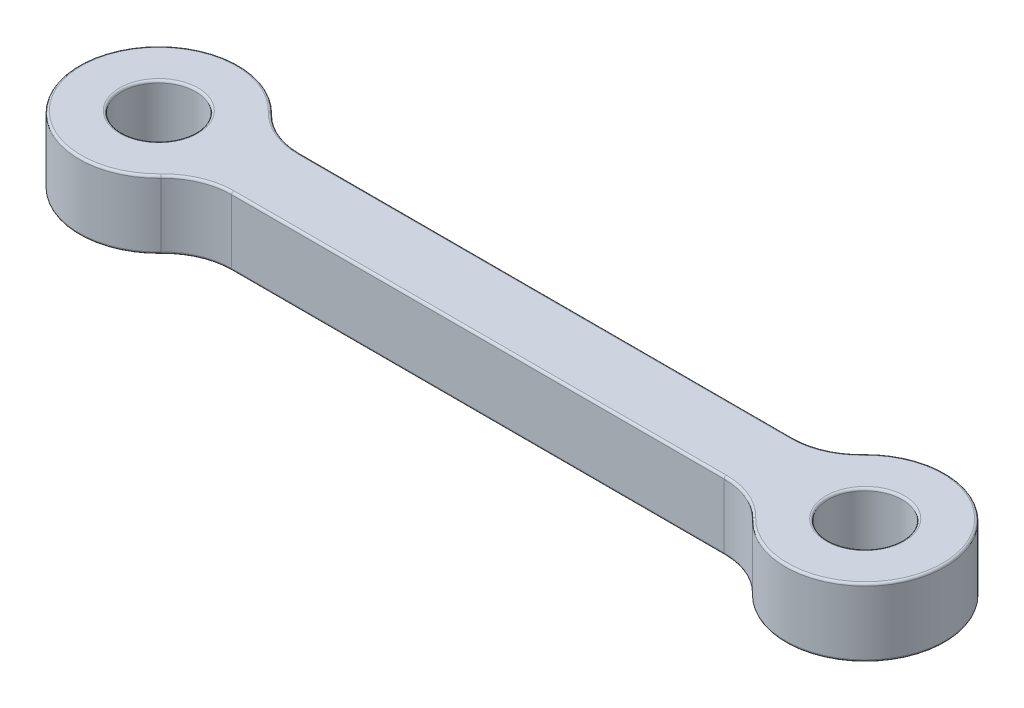
ISO-10303-21;
HEADER;
FILE_DESCRIPTION(('STEP AP214'),'2;1');
FILE_NAME('part.step','',(''),(''),'','','');
FILE_SCHEMA(('AUTOMOTIVE_DESIGN { 1 0 10303 214 1 1 1 1 }'));
ENDSEC;
DATA;
#1=APPLICATION_CONTEXT('core data for automotive mechanical design processes');
#2=APPLICATION_PROTOCOL_DEFINITION('international standard','automotive_design',2000,#1);
#3=PRODUCT_CONTEXT('',#1,'mechanical');
#4=PRODUCT('Part','Part','',(#3));
#5=PRODUCT_RELATED_PRODUCT_CATEGORY('part','',(#4));
#6=PRODUCT_DEFINITION_FORMATION('','',#4);
#7=PRODUCT_DEFINITION_CONTEXT('part definition',#1,'design');
#8=PRODUCT_DEFINITION('design','',#6,#7);
#9=PRODUCT_DEFINITION_SHAPE('','',#8);
#10=(LENGTH_UNIT() NAMED_UNIT(*) SI_UNIT(.MILLI.,.METRE.));
#11=(NAMED_UNIT(*) PLANE_ANGLE_UNIT() SI_UNIT($,.RADIAN.));
#12=(NAMED_UNIT(*) SI_UNIT($,.STERADIAN.) SOLID_ANGLE_UNIT());
#13=UNCERTAINTY_MEASURE_WITH_UNIT(LENGTH_MEASURE(1.E-05),#10,'distance_accuracy_value','');
#14=(GEOMETRIC_REPRESENTATION_CONTEXT(3) GLOBAL_UNCERTAINTY_ASSIGNED_CONTEXT((#13)) GLOBAL_UNIT_ASSIGNED_CONTEXT((#10,
#11,#12)) REPRESENTATION_CONTEXT('',''));
#15=CARTESIAN_POINT('',(0.,0.,0.));
#16=DIRECTION('',(0.,0.,1.));
#17=DIRECTION('',(1.,0.,0.));
#18=AXIS2_PLACEMENT_3D('',#15,#16,#17);
#19=CARTESIAN_POINT('',(-15.5,4.5,-3.));
#20=DIRECTION('',(0.,0.,-1.));
#21=DIRECTION('',(-1.,0.,0.));
#22=AXIS2_PLACEMENT_3D('',#19,#20,#21);
#23=PLANE('',#22);
#24=DIRECTION('',(0.,-1.,0.));
#25=VECTOR('',#24,1.);
#26=CARTESIAN_POINT('',(37.1191684803531,4.5,-3.));
#27=LINE('',#26,#25);
#28=CARTESIAN_POINT('',(37.1191684803531,4.3,-3.));
#29=VERTEX_POINT('',#28);
#30=CARTESIAN_POINT('',(37.1191684803531,-1.3,-3.));
#31=VERTEX_POINT('',#30);
#32=EDGE_CURVE('E293',#29,#31,#27,.T.);
#33=ORIENTED_EDGE('',*,*,#32,.T.);
#34=DIRECTION('',(1.,0.,0.));
#35=VECTOR('',#34,1.);
#36=CARTESIAN_POINT('',(-6.11916848035313,-1.3,-3.));
#37=LINE('',#36,#35);
#38=CARTESIAN_POINT('',(-6.11916848035313,-1.3,-3.));
#39=VERTEX_POINT('',#38);
#40=EDGE_CURVE('E240',#31,#39,#37,.F.);
#41=ORIENTED_EDGE('',*,*,#40,.T.);
#42=DIRECTION('',(0.,-1.,0.));
#43=VECTOR('',#42,1.);
#44=CARTESIAN_POINT('',(-6.11916848035313,4.5,-3.));
#45=LINE('',#44,#43);
#46=CARTESIAN_POINT('',(-6.11916848035313,4.3,-3.));
#47=VERTEX_POINT('',#46);
#48=EDGE_CURVE('E173',#47,#39,#45,.T.);
#49=ORIENTED_EDGE('',*,*,#48,.F.);
#50=DIRECTION('',(1.,0.,0.));
#51=VECTOR('',#50,1.);
#52=CARTESIAN_POINT('',(-15.5,4.3,-3.));
#53=LINE('',#52,#51);
#54=EDGE_CURVE('E238',#47,#29,#53,.T.);
#55=ORIENTED_EDGE('',*,*,#54,.T.);
#56=EDGE_LOOP('',(#33,#41,#49,#55));
#57=FACE_BOUND('',#56,.T.);
#58=ADVANCED_FACE('F37',(#57),#23,.T.);
#59=CARTESIAN_POINT('',(-6.11916848035313,4.5,-9.));
#60=DIRECTION('',(0.,-1.,0.));
#61=DIRECTION('',(0.,0.,-1.));
#62=AXIS2_PLACEMENT_3D('',#59,#60,#61);
#63=CYLINDRICAL_SURFACE('',#62,6.);
#64=ORIENTED_EDGE('',*,*,#48,.T.);
#65=CARTESIAN_POINT('',(-6.11916848035313,-1.3,-9.));
#66=DIRECTION('',(0.,1.,0.));
#67=DIRECTION('',(0.,0.,1.));
#68=AXIS2_PLACEMENT_3D('',#65,#66,#67);
#69=CIRCLE('',#68,6.);
#70=CARTESIAN_POINT('',(-10.4487830278824,-1.3,-4.84615384615385));
#71=VERTEX_POINT('',#70);
#72=EDGE_CURVE('E172',#39,#71,#69,.F.);
#73=ORIENTED_EDGE('',*,*,#72,.T.);
#74=DIRECTION('',(0.,-1.,0.));
#75=VECTOR('',#74,1.);
#76=CARTESIAN_POINT('',(-10.4487830278824,4.5,-4.84615384615385));
#77=LINE('',#76,#75);
#78=CARTESIAN_POINT('',(-10.4487830278824,4.3,-4.84615384615385));
#79=VERTEX_POINT('',#78);
#80=EDGE_CURVE('E154',#79,#71,#77,.T.);
#81=ORIENTED_EDGE('',*,*,#80,.F.);
#82=CARTESIAN_POINT('',(-6.11916848035313,4.3,-9.));
#83=DIRECTION('',(0.,1.,0.));
#84=DIRECTION('',(0.,0.,1.));
#85=AXIS2_PLACEMENT_3D('',#82,#83,#84);
#86=CIRCLE('',#85,6.);
#87=EDGE_CURVE('E169',#79,#47,#86,.T.);
#88=ORIENTED_EDGE('',*,*,#87,.T.);
#89=EDGE_LOOP('',(#64,#73,#81,#88));
#90=FACE_BOUND('',#89,.T.);
#91=ADVANCED_FACE('F167',(#90),#63,.F.);
#92=CARTESIAN_POINT('',(-15.5,4.5,0.));
#93=DIRECTION('',(0.,-1.,0.));
#94=DIRECTION('',(0.,0.,-1.));
#95=AXIS2_PLACEMENT_3D('',#92,#93,#94);
#96=CYLINDRICAL_SURFACE('',#95,7.);
#97=ORIENTED_EDGE('',*,*,#80,.T.);
#98=CARTESIAN_POINT('',(-15.5,-1.3,0.));
#99=DIRECTION('',(0.,1.,0.));
#100=DIRECTION('',(0.,0.,1.));
#101=AXIS2_PLACEMENT_3D('',#98,#99,#100);
#102=CIRCLE('',#101,7.);
#103=CARTESIAN_POINT('',(-10.4487830278824,-1.3,4.84615384615385));
#104=VERTEX_POINT('',#103);
#105=EDGE_CURVE('E161',#71,#104,#102,.T.);
#106=ORIENTED_EDGE('',*,*,#105,.T.);
#107=DIRECTION('',(0.,-1.,0.));
#108=VECTOR('',#107,1.);
#109=CARTESIAN_POINT('',(-10.4487830278824,4.5,4.84615384615385));
#110=LINE('',#109,#108);
#111=CARTESIAN_POINT('',(-10.4487830278824,4.3,4.84615384615385));
#112=VERTEX_POINT('',#111);
#113=EDGE_CURVE('E156',#112,#104,#110,.T.);
#114=ORIENTED_EDGE('',*,*,#113,.F.);
#115=CARTESIAN_POINT('',(-15.5,4.3,0.));
#116=DIRECTION('',(0.,1.,0.));
#117=DIRECTION('',(0.,0.,1.));
#118=AXIS2_PLACEMENT_3D('',#115,#116,#117);
#119=CIRCLE('',#118,7.);
#120=EDGE_CURVE('E151',#112,#79,#119,.F.);
#121=ORIENTED_EDGE('',*,*,#120,.T.);
#122=EDGE_LOOP('',(#97,#106,#114,#121));
#123=FACE_BOUND('',#122,.T.);
#124=ADVANCED_FACE('F153',(#123),#96,.T.);
#125=CARTESIAN_POINT('',(-6.11916848035313,4.5,9.));
#126=DIRECTION('',(0.,-1.,0.));
#127=DIRECTION('',(0.,0.,-1.));
#128=AXIS2_PLACEMENT_3D('',#125,#126,#127);
#129=CYLINDRICAL_SURFACE('',#128,6.);
#130=ORIENTED_EDGE('',*,*,#113,.T.);
#131=CARTESIAN_POINT('',(-6.11916848035313,-1.3,9.));
#132=DIRECTION('',(0.,1.,0.));
#133=DIRECTION('',(0.,0.,1.));
#134=AXIS2_PLACEMENT_3D('',#131,#132,#133);
#135=CIRCLE('',#134,6.);
#136=CARTESIAN_POINT('',(-6.11916848035313,-1.3,3.));
#137=VERTEX_POINT('',#136);
#138=EDGE_CURVE('E219',#104,#137,#135,.F.);
#139=ORIENTED_EDGE('',*,*,#138,.T.);
#140=DIRECTION('',(0.,-1.,0.));
#141=VECTOR('',#140,1.);
#142=CARTESIAN_POINT('',(-6.11916848035313,4.5,3.));
#143=LINE('',#142,#141);
#144=CARTESIAN_POINT('',(-6.11916848035313,4.3,3.));
#145=VERTEX_POINT('',#144);
#146=EDGE_CURVE('E339',#145,#137,#143,.T.);
#147=ORIENTED_EDGE('',*,*,#146,.F.);
#148=CARTESIAN_POINT('',(-6.11916848035313,4.3,9.));
#149=DIRECTION('',(0.,1.,0.));
#150=DIRECTION('',(0.,0.,1.));
#151=AXIS2_PLACEMENT_3D('',#148,#149,#150);
#152=CIRCLE('',#151,6.);
#153=EDGE_CURVE('E217',#145,#112,#152,.T.);
#154=ORIENTED_EDGE('',*,*,#153,.T.);
#155=EDGE_LOOP('',(#130,#139,#147,#154));
#156=FACE_BOUND('',#155,.T.);
#157=ADVANCED_FACE('F344',(#156),#129,.F.);
#158=CARTESIAN_POINT('',(-15.5,4.5,3.));
#159=DIRECTION('',(0.,0.,-1.));
#160=DIRECTION('',(-1.,0.,0.));
#161=AXIS2_PLACEMENT_3D('',#158,#159,#160);
#162=PLANE('',#161);
#163=ORIENTED_EDGE('',*,*,#146,.T.);
#164=DIRECTION('',(1.,0.,0.));
#165=VECTOR('',#164,1.);
#166=CARTESIAN_POINT('',(-15.5,-1.3,3.));
#167=LINE('',#166,#165);
#168=CARTESIAN_POINT('',(37.1191684803531,-1.3,3.));
#169=VERTEX_POINT('',#168);
#170=EDGE_CURVE('E223',#137,#169,#167,.T.);
#171=ORIENTED_EDGE('',*,*,#170,.T.);
#172=DIRECTION('',(0.,-1.,0.));
#173=VECTOR('',#172,1.);
#174=CARTESIAN_POINT('',(37.1191684803531,4.5,3.));
#175=LINE('',#174,#173);
#176=CARTESIAN_POINT('',(37.1191684803531,4.3,3.));
#177=VERTEX_POINT('',#176);
#178=EDGE_CURVE('E336',#177,#169,#175,.T.);
#179=ORIENTED_EDGE('',*,*,#178,.F.);
#180=DIRECTION('',(1.,0.,0.));
#181=VECTOR('',#180,1.);
#182=CARTESIAN_POINT('',(-6.11916848035313,4.3,3.));
#183=LINE('',#182,#181);
#184=EDGE_CURVE('E221',#177,#145,#183,.F.);
#185=ORIENTED_EDGE('',*,*,#184,.T.);
#186=EDGE_LOOP('',(#163,#171,#179,#185));
#187=FACE_BOUND('',#186,.T.);
#188=ADVANCED_FACE('F387',(#187),#162,.F.);
#189=CARTESIAN_POINT('',(37.1191684803531,4.5,9.));
#190=DIRECTION('',(0.,-1.,0.));
#191=DIRECTION('',(0.,0.,-1.));
#192=AXIS2_PLACEMENT_3D('',#189,#190,#191);
#193=CYLINDRICAL_SURFACE('',#192,6.);
#194=ORIENTED_EDGE('',*,*,#178,.T.);
#195=CARTESIAN_POINT('',(37.1191684803531,-1.3,9.));
#196=DIRECTION('',(0.,1.,0.));
#197=DIRECTION('',(0.,0.,1.));
#198=AXIS2_PLACEMENT_3D('',#195,#196,#197);
#199=CIRCLE('',#198,6.);
#200=CARTESIAN_POINT('',(41.4487830278825,-1.3,4.84615384615385));
#201=VERTEX_POINT('',#200);
#202=EDGE_CURVE('E227',#169,#201,#199,.F.);
#203=ORIENTED_EDGE('',*,*,#202,.T.);
#204=DIRECTION('',(0.,-1.,0.));
#205=VECTOR('',#204,1.);
#206=CARTESIAN_POINT('',(41.4487830278825,4.5,4.84615384615385));
#207=LINE('',#206,#205);
#208=CARTESIAN_POINT('',(41.4487830278825,4.3,4.84615384615385));
#209=VERTEX_POINT('',#208);
#210=EDGE_CURVE('E331',#209,#201,#207,.T.);
#211=ORIENTED_EDGE('',*,*,#210,.F.);
#212=CARTESIAN_POINT('',(37.1191684803531,4.3,9.));
#213=DIRECTION('',(0.,1.,0.));
#214=DIRECTION('',(0.,0.,1.));
#215=AXIS2_PLACEMENT_3D('',#212,#213,#214);
#216=CIRCLE('',#215,6.);
#217=EDGE_CURVE('E225',#209,#177,#216,.T.);
#218=ORIENTED_EDGE('',*,*,#217,.T.);
#219=EDGE_LOOP('',(#194,#203,#211,#218));
#220=FACE_BOUND('',#219,.T.);
#221=ADVANCED_FACE('F389',(#220),#193,.F.);
#222=CARTESIAN_POINT('',(46.5,4.5,0.));
#223=DIRECTION('',(0.,-1.,0.));
#224=DIRECTION('',(0.,0.,-1.));
#225=AXIS2_PLACEMENT_3D('',#222,#223,#224);
#226=CYLINDRICAL_SURFACE('',#225,7.);
#227=ORIENTED_EDGE('',*,*,#210,.T.);
#228=CARTESIAN_POINT('',(46.5,-1.3,0.));
#229=DIRECTION('',(0.,1.,0.));
#230=DIRECTION('',(0.,0.,1.));
#231=AXIS2_PLACEMENT_3D('',#228,#229,#230);
#232=CIRCLE('',#231,7.);
#233=CARTESIAN_POINT('',(41.4487830278825,-1.3,-4.84615384615385));
#234=VERTEX_POINT('',#233);
#235=EDGE_CURVE('E231',#201,#234,#232,.T.);
#236=ORIENTED_EDGE('',*,*,#235,.T.);
#237=DIRECTION('',(0.,-1.,0.));
#238=VECTOR('',#237,1.);
#239=CARTESIAN_POINT('',(41.4487830278825,4.5,-4.84615384615385));
#240=LINE('',#239,#238);
#241=CARTESIAN_POINT('',(41.4487830278825,4.3,-4.84615384615385));
#242=VERTEX_POINT('',#241);
#243=EDGE_CURVE('E329',#242,#234,#240,.T.);
#244=ORIENTED_EDGE('',*,*,#243,.F.);
#245=CARTESIAN_POINT('',(46.5,4.3,0.));
#246=DIRECTION('',(0.,1.,0.));
#247=DIRECTION('',(0.,0.,1.));
#248=AXIS2_PLACEMENT_3D('',#245,#246,#247);
#249=CIRCLE('',#248,7.);
#250=EDGE_CURVE('E229',#242,#209,#249,.F.);
#251=ORIENTED_EDGE('',*,*,#250,.T.);
#252=EDGE_LOOP('',(#227,#236,#244,#251));
#253=FACE_BOUND('',#252,.T.);
#254=ADVANCED_FACE('F422',(#253),#226,.T.);
#255=CARTESIAN_POINT('',(46.5,4.5,0.));
#256=DIRECTION('',(0.,-1.,0.));
#257=DIRECTION('',(0.,0.,-1.));
#258=AXIS2_PLACEMENT_3D('',#255,#256,#257);
#259=CYLINDRICAL_SURFACE('',#258,3.25000000000001);
#260=CARTESIAN_POINT('',(46.5,-1.3,0.));
#261=DIRECTION('',(0.,1.,0.));
#262=DIRECTION('',(0.,0.,1.));
#263=AXIS2_PLACEMENT_3D('',#260,#261,#262);
#264=CIRCLE('',#263,3.25000000000001);
#265=CARTESIAN_POINT('',(46.5,-1.3,3.25000000000001));
#266=VERTEX_POINT('',#265);
#267=EDGE_CURVE('E245',#266,#266,#264,.F.);
#268=ORIENTED_EDGE('',*,*,#267,.T.);
#269=EDGE_LOOP('',(#268));
#270=FACE_BOUND('',#269,.T.);
#271=CARTESIAN_POINT('',(46.5,4.3,0.));
#272=DIRECTION('',(0.,1.,0.));
#273=DIRECTION('',(0.,0.,1.));
#274=AXIS2_PLACEMENT_3D('',#271,#272,#273);
#275=CIRCLE('',#274,3.25000000000001);
#276=CARTESIAN_POINT('',(46.5,4.3,3.25000000000001));
#277=VERTEX_POINT('',#276);
#278=EDGE_CURVE('E242',#277,#277,#275,.T.);
#279=ORIENTED_EDGE('',*,*,#278,.T.);
#280=EDGE_LOOP('',(#279));
#281=FACE_BOUND('',#280,.T.);
#282=ADVANCED_FACE('F418',(#270,#281),#259,.F.);
#283=CARTESIAN_POINT('',(-15.5,4.5,0.));
#284=DIRECTION('',(0.,-1.,0.));
#285=DIRECTION('',(0.,0.,-1.));
#286=AXIS2_PLACEMENT_3D('',#283,#284,#285);
#287=CYLINDRICAL_SURFACE('',#286,3.25);
#288=CARTESIAN_POINT('',(-15.5,-1.3,0.));
#289=DIRECTION('',(0.,1.,0.));
#290=DIRECTION('',(0.,0.,1.));
#291=AXIS2_PLACEMENT_3D('',#288,#289,#290);
#292=CIRCLE('',#291,3.25);
#293=CARTESIAN_POINT('',(-15.5,-1.3,3.25));
#294=VERTEX_POINT('',#293);
#295=EDGE_CURVE('E251',#294,#294,#292,.F.);
#296=ORIENTED_EDGE('',*,*,#295,.T.);
#297=EDGE_LOOP('',(#296));
#298=FACE_BOUND('',#297,.T.);
#299=CARTESIAN_POINT('',(-15.5,4.3,0.));
#300=DIRECTION('',(0.,1.,0.));
#301=DIRECTION('',(0.,0.,1.));
#302=AXIS2_PLACEMENT_3D('',#299,#300,#301);
#303=CIRCLE('',#302,3.25);
#304=CARTESIAN_POINT('',(-15.5,4.3,3.25));
#305=VERTEX_POINT('',#304);
#306=EDGE_CURVE('E248',#305,#305,#303,.T.);
#307=ORIENTED_EDGE('',*,*,#306,.T.);
#308=EDGE_LOOP('',(#307));
#309=FACE_BOUND('',#308,.T.);
#310=ADVANCED_FACE('F421',(#298,#309),#287,.F.);
#311=CARTESIAN_POINT('',(37.1191684803531,4.5,-9.));
#312=DIRECTION('',(0.,-1.,0.));
#313=DIRECTION('',(0.,0.,-1.));
#314=AXIS2_PLACEMENT_3D('',#311,#312,#313);
#315=CYLINDRICAL_SURFACE('',#314,6.);
#316=ORIENTED_EDGE('',*,*,#243,.T.);
#317=CARTESIAN_POINT('',(37.1191684803531,-1.3,-9.));
#318=DIRECTION('',(0.,1.,0.));
#319=DIRECTION('',(0.,0.,1.));
#320=AXIS2_PLACEMENT_3D('',#317,#318,#319);
#321=CIRCLE('',#320,6.);
#322=EDGE_CURVE('E236',#234,#31,#321,.F.);
#323=ORIENTED_EDGE('',*,*,#322,.T.);
#324=ORIENTED_EDGE('',*,*,#32,.F.);
#325=CARTESIAN_POINT('',(37.1191684803531,4.3,-9.));
#326=DIRECTION('',(0.,1.,0.));
#327=DIRECTION('',(0.,0.,1.));
#328=AXIS2_PLACEMENT_3D('',#325,#326,#327);
#329=CIRCLE('',#328,6.);
#330=EDGE_CURVE('E233',#29,#242,#329,.T.);
#331=ORIENTED_EDGE('',*,*,#330,.T.);
#332=EDGE_LOOP('',(#316,#323,#324,#331));
#333=FACE_BOUND('',#332,.T.);
#334=ADVANCED_FACE('F326',(#333),#315,.F.);
#335=CARTESIAN_POINT('',(-15.5,4.5,0.));
#336=DIRECTION('',(0.,1.,0.));
#337=DIRECTION('',(0.,0.,1.));
#338=AXIS2_PLACEMENT_3D('',#335,#336,#337);
#339=PLANE('',#338);
#340=CARTESIAN_POINT('',(46.5,4.5,0.));
#341=DIRECTION('',(0.,1.,0.));
#342=DIRECTION('',(0.,0.,1.));
#343=AXIS2_PLACEMENT_3D('',#340,#341,#342);
#344=CIRCLE('',#343,6.8);
#345=CARTESIAN_POINT('',(41.5931035128001,4.5,4.70769230769231));
#346=VERTEX_POINT('',#345);
#347=CARTESIAN_POINT('',(41.5931035128001,4.5,-4.70769230769231));
#348=VERTEX_POINT('',#347);
#349=EDGE_CURVE('E46',#346,#348,#344,.T.);
#350=ORIENTED_EDGE('',*,*,#349,.T.);
#351=CARTESIAN_POINT('',(37.1191684803531,4.5,-9.));
#352=DIRECTION('',(0.,1.,0.));
#353=DIRECTION('',(0.,0.,1.));
#354=AXIS2_PLACEMENT_3D('',#351,#352,#353);
#355=CIRCLE('',#354,6.2);
#356=CARTESIAN_POINT('',(37.1191684803531,4.5,-2.8));
#357=VERTEX_POINT('',#356);
#358=EDGE_CURVE('E11',#348,#357,#355,.F.);
#359=ORIENTED_EDGE('',*,*,#358,.T.);
#360=DIRECTION('',(1.,0.,0.));
#361=VECTOR('',#360,1.);
#362=CARTESIAN_POINT('',(-15.5,4.5,-2.8));
#363=LINE('',#362,#361);
#364=CARTESIAN_POINT('',(-6.11916848035313,4.5,-2.8));
#365=VERTEX_POINT('',#364);
#366=EDGE_CURVE('E260',#357,#365,#363,.F.);
#367=ORIENTED_EDGE('',*,*,#366,.T.);
#368=CARTESIAN_POINT('',(-6.11916848035313,4.5,-9.));
#369=DIRECTION('',(0.,1.,0.));
#370=DIRECTION('',(0.,0.,1.));
#371=AXIS2_PLACEMENT_3D('',#368,#369,#370);
#372=CIRCLE('',#371,6.2);
#373=CARTESIAN_POINT('',(-10.5931035128001,4.5,-4.70769230769231));
#374=VERTEX_POINT('',#373);
#375=EDGE_CURVE('E262',#365,#374,#372,.F.);
#376=ORIENTED_EDGE('',*,*,#375,.T.);
#377=CARTESIAN_POINT('',(-15.5,4.5,0.));
#378=DIRECTION('',(0.,1.,0.));
#379=DIRECTION('',(0.,0.,1.));
#380=AXIS2_PLACEMENT_3D('',#377,#378,#379);
#381=CIRCLE('',#380,6.8);
#382=CARTESIAN_POINT('',(-10.5931035128001,4.5,4.70769230769231));
#383=VERTEX_POINT('',#382);
#384=EDGE_CURVE('E179',#374,#383,#381,.T.);
#385=ORIENTED_EDGE('',*,*,#384,.T.);
#386=CARTESIAN_POINT('',(-6.11916848035313,4.5,9.));
#387=DIRECTION('',(0.,1.,0.));
#388=DIRECTION('',(0.,0.,1.));
#389=AXIS2_PLACEMENT_3D('',#386,#387,#388);
#390=CIRCLE('',#389,6.2);
#391=CARTESIAN_POINT('',(-6.11916848035313,4.5,2.8));
#392=VERTEX_POINT('',#391);
#393=EDGE_CURVE('E265',#383,#392,#390,.F.);
#394=ORIENTED_EDGE('',*,*,#393,.T.);
#395=DIRECTION('',(1.,0.,0.));
#396=VECTOR('',#395,1.);
#397=CARTESIAN_POINT('',(37.1191684803531,4.5,2.8));
#398=LINE('',#397,#396);
#399=CARTESIAN_POINT('',(37.1191684803531,4.5,2.8));
#400=VERTEX_POINT('',#399);
#401=EDGE_CURVE('E267',#392,#400,#398,.T.);
#402=ORIENTED_EDGE('',*,*,#401,.T.);
#403=CARTESIAN_POINT('',(37.1191684803531,4.5,9.));
#404=DIRECTION('',(0.,1.,0.));
#405=DIRECTION('',(0.,0.,1.));
#406=AXIS2_PLACEMENT_3D('',#403,#404,#405);
#407=CIRCLE('',#406,6.2);
#408=EDGE_CURVE('E57',#400,#346,#407,.F.);
#409=ORIENTED_EDGE('',*,*,#408,.T.);
#410=EDGE_LOOP('',(#350,#359,#367,#376,#385,#394,#402,#409));
#411=FACE_BOUND('',#410,.T.);
#412=CARTESIAN_POINT('',(46.5,4.5,0.));
#413=DIRECTION('',(0.,1.,0.));
#414=DIRECTION('',(0.,0.,1.));
#415=AXIS2_PLACEMENT_3D('',#412,#413,#414);
#416=CIRCLE('',#415,3.45000000000001);
#417=CARTESIAN_POINT('',(46.5,4.5,3.45000000000001));
#418=VERTEX_POINT('',#417);
#419=EDGE_CURVE('E257',#418,#418,#416,.F.);
#420=ORIENTED_EDGE('',*,*,#419,.T.);
#421=EDGE_LOOP('',(#420));
#422=FACE_BOUND('',#421,.T.);
#423=CARTESIAN_POINT('',(-15.5,4.5,0.));
#424=DIRECTION('',(0.,1.,0.));
#425=DIRECTION('',(0.,0.,1.));
#426=AXIS2_PLACEMENT_3D('',#423,#424,#425);
#427=CIRCLE('',#426,3.45);
#428=CARTESIAN_POINT('',(-15.5,4.5,3.45));
#429=VERTEX_POINT('',#428);
#430=EDGE_CURVE('E254',#429,#429,#427,.F.);
#431=ORIENTED_EDGE('',*,*,#430,.T.);
#432=EDGE_LOOP('',(#431));
#433=FACE_BOUND('',#432,.T.);
#434=ADVANCED_FACE('F312',(#411,#422,#433),#339,.T.);
#435=CARTESIAN_POINT('',(-15.5,-1.5,0.));
#436=DIRECTION('',(0.,1.,0.));
#437=DIRECTION('',(0.,0.,1.));
#438=AXIS2_PLACEMENT_3D('',#435,#436,#437);
#439=PLANE('',#438);
#440=CARTESIAN_POINT('',(-15.5,-1.5,0.));
#441=DIRECTION('',(0.,1.,0.));
#442=DIRECTION('',(0.,0.,1.));
#443=AXIS2_PLACEMENT_3D('',#440,#441,#442);
#444=CIRCLE('',#443,6.8);
#445=CARTESIAN_POINT('',(-10.5931035128001,-1.5,4.70769230769231));
#446=VERTEX_POINT('',#445);
#447=CARTESIAN_POINT('',(-10.5931035128001,-1.5,-4.70769230769231));
#448=VERTEX_POINT('',#447);
#449=EDGE_CURVE('E212',#446,#448,#444,.F.);
#450=ORIENTED_EDGE('',*,*,#449,.T.);
#451=CARTESIAN_POINT('',(-6.11916848035313,-1.5,-9.));
#452=DIRECTION('',(0.,1.,0.));
#453=DIRECTION('',(0.,0.,1.));
#454=AXIS2_PLACEMENT_3D('',#451,#452,#453);
#455=CIRCLE('',#454,6.2);
#456=CARTESIAN_POINT('',(-6.11916848035313,-1.5,-2.8));
#457=VERTEX_POINT('',#456);
#458=EDGE_CURVE('E162',#448,#457,#455,.T.);
#459=ORIENTED_EDGE('',*,*,#458,.T.);
#460=DIRECTION('',(1.,0.,0.));
#461=VECTOR('',#460,1.);
#462=CARTESIAN_POINT('',(37.1191684803531,-1.5,-2.8));
#463=LINE('',#462,#461);
#464=CARTESIAN_POINT('',(37.1191684803531,-1.5,-2.8));
#465=VERTEX_POINT('',#464);
#466=EDGE_CURVE('E200',#457,#465,#463,.T.);
#467=ORIENTED_EDGE('',*,*,#466,.T.);
#468=CARTESIAN_POINT('',(37.1191684803531,-1.5,-9.));
#469=DIRECTION('',(0.,1.,0.));
#470=DIRECTION('',(0.,0.,1.));
#471=AXIS2_PLACEMENT_3D('',#468,#469,#470);
#472=CIRCLE('',#471,6.2);
#473=CARTESIAN_POINT('',(41.5931035128001,-1.5,-4.70769230769231));
#474=VERTEX_POINT('',#473);
#475=EDGE_CURVE('E202',#465,#474,#472,.T.);
#476=ORIENTED_EDGE('',*,*,#475,.T.);
#477=CARTESIAN_POINT('',(46.5,-1.5,0.));
#478=DIRECTION('',(0.,1.,0.));
#479=DIRECTION('',(0.,0.,1.));
#480=AXIS2_PLACEMENT_3D('',#477,#478,#479);
#481=CIRCLE('',#480,6.8);
#482=CARTESIAN_POINT('',(41.5931035128001,-1.5,4.70769230769231));
#483=VERTEX_POINT('',#482);
#484=EDGE_CURVE('E204',#474,#483,#481,.F.);
#485=ORIENTED_EDGE('',*,*,#484,.T.);
#486=CARTESIAN_POINT('',(37.1191684803531,-1.5,9.));
#487=DIRECTION('',(0.,1.,0.));
#488=DIRECTION('',(0.,0.,1.));
#489=AXIS2_PLACEMENT_3D('',#486,#487,#488);
#490=CIRCLE('',#489,6.2);
#491=CARTESIAN_POINT('',(37.1191684803531,-1.5,2.8));
#492=VERTEX_POINT('',#491);
#493=EDGE_CURVE('E206',#483,#492,#490,.T.);
#494=ORIENTED_EDGE('',*,*,#493,.T.);
#495=DIRECTION('',(1.,0.,0.));
#496=VECTOR('',#495,1.);
#497=CARTESIAN_POINT('',(-15.5,-1.5,2.8));
#498=LINE('',#497,#496);
#499=CARTESIAN_POINT('',(-6.11916848035313,-1.5,2.8));
#500=VERTEX_POINT('',#499);
#501=EDGE_CURVE('E208',#492,#500,#498,.F.);
#502=ORIENTED_EDGE('',*,*,#501,.T.);
#503=CARTESIAN_POINT('',(-6.11916848035313,-1.5,9.));
#504=DIRECTION('',(0.,1.,0.));
#505=DIRECTION('',(0.,0.,1.));
#506=AXIS2_PLACEMENT_3D('',#503,#504,#505);
#507=CIRCLE('',#506,6.2);
#508=EDGE_CURVE('E210',#500,#446,#507,.T.);
#509=ORIENTED_EDGE('',*,*,#508,.T.);
#510=EDGE_LOOP('',(#450,#459,#467,#476,#485,#494,#502,#509));
#511=FACE_BOUND('',#510,.T.);
#512=CARTESIAN_POINT('',(46.5,-1.5,0.));
#513=DIRECTION('',(0.,1.,0.));
#514=DIRECTION('',(0.,0.,1.));
#515=AXIS2_PLACEMENT_3D('',#512,#513,#514);
#516=CIRCLE('',#515,3.45000000000001);
#517=CARTESIAN_POINT('',(46.5,-1.5,3.45000000000001));
#518=VERTEX_POINT('',#517);
#519=EDGE_CURVE('E197',#518,#518,#516,.T.);
#520=ORIENTED_EDGE('',*,*,#519,.T.);
#521=EDGE_LOOP('',(#520));
#522=FACE_BOUND('',#521,.T.);
#523=CARTESIAN_POINT('',(-15.5,-1.5,0.));
#524=DIRECTION('',(0.,1.,0.));
#525=DIRECTION('',(0.,0.,1.));
#526=AXIS2_PLACEMENT_3D('',#523,#524,#525);
#527=CIRCLE('',#526,3.45);
#528=CARTESIAN_POINT('',(-15.5,-1.5,3.45));
#529=VERTEX_POINT('',#528);
#530=EDGE_CURVE('E191',#529,#529,#527,.T.);
#531=ORIENTED_EDGE('',*,*,#530,.T.);
#532=EDGE_LOOP('',(#531));
#533=FACE_BOUND('',#532,.T.);
#534=ADVANCED_FACE('F358',(#511,#522,#533),#439,.F.);
#535=CARTESIAN_POINT('',(37.1191684803531,-1.3,9.));
#536=DIRECTION('',(0.,1.,0.));
#537=DIRECTION('',(0.,0.,1.));
#538=AXIS2_PLACEMENT_3D('',#535,#536,#537);
#539=TOROIDAL_SURFACE('',#538,6.2,0.2);
#540=CARTESIAN_POINT('',(37.1191684803531,-1.3,2.8));
#541=DIRECTION('',(-1.,0.,0.));
#542=DIRECTION('',(0.,0.,1.));
#543=AXIS2_PLACEMENT_3D('',#540,#541,#542);
#544=CIRCLE('',#543,0.2);
#545=EDGE_CURVE('E287',#492,#169,#544,.T.);
#546=ORIENTED_EDGE('',*,*,#545,.F.);
#547=ORIENTED_EDGE('',*,*,#493,.F.);
#548=CARTESIAN_POINT('',(41.5931035128001,-1.3,4.70769230769231));
#549=DIRECTION('',(0.692307692307693,0.,0.72160242458822));
#550=DIRECTION('',(0.72160242458822,0.,-0.692307692307693));
#551=AXIS2_PLACEMENT_3D('',#548,#549,#550);
#552=CIRCLE('',#551,0.2);
#553=EDGE_CURVE('E290',#201,#483,#552,.T.);
#554=ORIENTED_EDGE('',*,*,#553,.F.);
#555=ORIENTED_EDGE('',*,*,#202,.F.);
#556=EDGE_LOOP('',(#546,#547,#554,#555));
#557=FACE_BOUND('',#556,.T.);
#558=ADVANCED_FACE('F379',(#557),#539,.T.);
#559=CARTESIAN_POINT('',(46.5,-1.3,0.));
#560=DIRECTION('',(0.,1.,0.));
#561=DIRECTION('',(0.,0.,1.));
#562=AXIS2_PLACEMENT_3D('',#559,#560,#561);
#563=TOROIDAL_SURFACE('',#562,6.8,0.2);
#564=ORIENTED_EDGE('',*,*,#553,.T.);
#565=ORIENTED_EDGE('',*,*,#484,.F.);
#566=CARTESIAN_POINT('',(41.5931035128001,-1.3,-4.70769230769231));
#567=DIRECTION('',(-0.692307692307693,0.,0.72160242458822));
#568=DIRECTION('',(0.72160242458822,0.,0.692307692307693));
#569=AXIS2_PLACEMENT_3D('',#566,#567,#568);
#570=CIRCLE('',#569,0.2);
#571=EDGE_CURVE('E284',#234,#474,#570,.T.);
#572=ORIENTED_EDGE('',*,*,#571,.F.);
#573=ORIENTED_EDGE('',*,*,#235,.F.);
#574=EDGE_LOOP('',(#564,#565,#572,#573));
#575=FACE_BOUND('',#574,.T.);
#576=ADVANCED_FACE('F374',(#575),#563,.T.);
#577=CARTESIAN_POINT('',(-15.5,-1.3,2.8));
#578=DIRECTION('',(1.,0.,0.));
#579=DIRECTION('',(0.,0.,-1.));
#580=AXIS2_PLACEMENT_3D('',#577,#578,#579);
#581=CYLINDRICAL_SURFACE('',#580,0.2);
#582=ORIENTED_EDGE('',*,*,#545,.T.);
#583=ORIENTED_EDGE('',*,*,#170,.F.);
#584=CARTESIAN_POINT('',(-6.11916848035313,-1.3,2.8));
#585=DIRECTION('',(-1.,0.,0.));
#586=DIRECTION('',(0.,0.,1.));
#587=AXIS2_PLACEMENT_3D('',#584,#585,#586);
#588=CIRCLE('',#587,0.2);
#589=EDGE_CURVE('E281',#500,#137,#588,.T.);
#590=ORIENTED_EDGE('',*,*,#589,.F.);
#591=ORIENTED_EDGE('',*,*,#501,.F.);
#592=EDGE_LOOP('',(#582,#583,#590,#591));
#593=FACE_BOUND('',#592,.T.);
#594=ADVANCED_FACE('F384',(#593),#581,.T.);
#595=CARTESIAN_POINT('',(37.1191684803531,-1.3,-9.));
#596=DIRECTION('',(0.,1.,0.));
#597=DIRECTION('',(0.,0.,1.));
#598=AXIS2_PLACEMENT_3D('',#595,#596,#597);
#599=TOROIDAL_SURFACE('',#598,6.2,0.2);
#600=ORIENTED_EDGE('',*,*,#571,.T.);
#601=ORIENTED_EDGE('',*,*,#475,.F.);
#602=CARTESIAN_POINT('',(37.1191684803531,-1.3,-2.8));
#603=DIRECTION('',(-1.,0.,0.));
#604=DIRECTION('',(0.,0.,1.));
#605=AXIS2_PLACEMENT_3D('',#602,#603,#604);
#606=CIRCLE('',#605,0.2);
#607=EDGE_CURVE('E278',#31,#465,#606,.T.);
#608=ORIENTED_EDGE('',*,*,#607,.F.);
#609=ORIENTED_EDGE('',*,*,#322,.F.);
#610=EDGE_LOOP('',(#600,#601,#608,#609));
#611=FACE_BOUND('',#610,.T.);
#612=ADVANCED_FACE('F370',(#611),#599,.T.);
#613=CARTESIAN_POINT('',(-6.11916848035313,-1.3,9.));
#614=DIRECTION('',(0.,1.,0.));
#615=DIRECTION('',(0.,0.,1.));
#616=AXIS2_PLACEMENT_3D('',#613,#614,#615);
#617=TOROIDAL_SURFACE('',#616,6.2,0.2);
#618=ORIENTED_EDGE('',*,*,#589,.T.);
#619=ORIENTED_EDGE('',*,*,#138,.F.);
#620=CARTESIAN_POINT('',(-10.5931035128001,-1.3,4.70769230769231));
#621=DIRECTION('',(-0.692307692307693,0.,0.72160242458822));
#622=DIRECTION('',(0.72160242458822,0.,0.692307692307693));
#623=AXIS2_PLACEMENT_3D('',#620,#621,#622);
#624=CIRCLE('',#623,0.2);
#625=EDGE_CURVE('E275',#446,#104,#624,.T.);
#626=ORIENTED_EDGE('',*,*,#625,.F.);
#627=ORIENTED_EDGE('',*,*,#508,.F.);
#628=EDGE_LOOP('',(#618,#619,#626,#627));
#629=FACE_BOUND('',#628,.T.);
#630=ADVANCED_FACE('F348',(#629),#617,.T.);
#631=CARTESIAN_POINT('',(-15.5,-1.3,-2.8));
#632=DIRECTION('',(-1.,0.,0.));
#633=DIRECTION('',(0.,0.,1.));
#634=AXIS2_PLACEMENT_3D('',#631,#632,#633);
#635=CYLINDRICAL_SURFACE('',#634,0.2);
#636=ORIENTED_EDGE('',*,*,#607,.T.);
#637=ORIENTED_EDGE('',*,*,#466,.F.);
#638=CARTESIAN_POINT('',(-6.11916848035313,-1.3,-2.8));
#639=DIRECTION('',(-1.,0.,0.));
#640=DIRECTION('',(0.,0.,1.));
#641=AXIS2_PLACEMENT_3D('',#638,#639,#640);
#642=CIRCLE('',#641,0.2);
#643=EDGE_CURVE('E273',#39,#457,#642,.T.);
#644=ORIENTED_EDGE('',*,*,#643,.F.);
#645=ORIENTED_EDGE('',*,*,#40,.F.);
#646=EDGE_LOOP('',(#636,#637,#644,#645));
#647=FACE_BOUND('',#646,.T.);
#648=ADVANCED_FACE('F366',(#647),#635,.T.);
#649=CARTESIAN_POINT('',(-15.5,-1.3,0.));
#650=DIRECTION('',(0.,1.,0.));
#651=DIRECTION('',(0.,0.,1.));
#652=AXIS2_PLACEMENT_3D('',#649,#650,#651);
#653=TOROIDAL_SURFACE('',#652,6.8,0.2);
#654=ORIENTED_EDGE('',*,*,#625,.T.);
#655=ORIENTED_EDGE('',*,*,#105,.F.);
#656=CARTESIAN_POINT('',(-10.5931035128001,-1.3,-4.70769230769231));
#657=DIRECTION('',(0.692307692307693,0.,0.72160242458822));
#658=DIRECTION('',(0.72160242458822,0.,-0.692307692307693));
#659=AXIS2_PLACEMENT_3D('',#656,#657,#658);
#660=CIRCLE('',#659,0.2);
#661=EDGE_CURVE('E271',#448,#71,#660,.T.);
#662=ORIENTED_EDGE('',*,*,#661,.F.);
#663=ORIENTED_EDGE('',*,*,#449,.F.);
#664=EDGE_LOOP('',(#654,#655,#662,#663));
#665=FACE_BOUND('',#664,.T.);
#666=ADVANCED_FACE('F354',(#665),#653,.T.);
#667=CARTESIAN_POINT('',(-6.11916848035313,-1.3,-9.));
#668=DIRECTION('',(0.,1.,0.));
#669=DIRECTION('',(0.,0.,1.));
#670=AXIS2_PLACEMENT_3D('',#667,#668,#669);
#671=TOROIDAL_SURFACE('',#670,6.2,0.2);
#672=ORIENTED_EDGE('',*,*,#643,.T.);
#673=ORIENTED_EDGE('',*,*,#458,.F.);
#674=ORIENTED_EDGE('',*,*,#661,.T.);
#675=ORIENTED_EDGE('',*,*,#72,.F.);
#676=EDGE_LOOP('',(#672,#673,#674,#675));
#677=FACE_BOUND('',#676,.T.);
#678=ADVANCED_FACE('F361',(#677),#671,.T.);
#679=CARTESIAN_POINT('',(46.5,-1.3,0.));
#680=DIRECTION('',(0.,1.,0.));
#681=DIRECTION('',(0.,0.,1.));
#682=AXIS2_PLACEMENT_3D('',#679,#680,#681);
#683=TOROIDAL_SURFACE('',#682,3.45000000000001,0.2);
#684=ORIENTED_EDGE('',*,*,#267,.F.);
#685=EDGE_LOOP('',(#684));
#686=FACE_BOUND('',#685,.T.);
#687=ORIENTED_EDGE('',*,*,#519,.F.);
#688=EDGE_LOOP('',(#687));
#689=FACE_BOUND('',#688,.T.);
#690=ADVANCED_FACE('F429',(#686,#689),#683,.T.);
#691=CARTESIAN_POINT('',(-15.5,-1.3,0.));
#692=DIRECTION('',(0.,1.,0.));
#693=DIRECTION('',(0.,0.,1.));
#694=AXIS2_PLACEMENT_3D('',#691,#692,#693);
#695=TOROIDAL_SURFACE('',#694,3.45,0.2);
#696=ORIENTED_EDGE('',*,*,#295,.F.);
#697=EDGE_LOOP('',(#696));
#698=FACE_BOUND('',#697,.T.);
#699=ORIENTED_EDGE('',*,*,#530,.F.);
#700=EDGE_LOOP('',(#699));
#701=FACE_BOUND('',#700,.T.);
#702=ADVANCED_FACE('F445',(#698,#701),#695,.T.);
#703=CARTESIAN_POINT('',(-6.11916848035313,4.3,9.));
#704=DIRECTION('',(0.,1.,0.));
#705=DIRECTION('',(0.,0.,1.));
#706=AXIS2_PLACEMENT_3D('',#703,#704,#705);
#707=TOROIDAL_SURFACE('',#706,6.2,0.2);
#708=CARTESIAN_POINT('',(-6.11916848035313,4.3,2.8));
#709=DIRECTION('',(1.,0.,0.));
#710=DIRECTION('',(0.,0.,-1.));
#711=AXIS2_PLACEMENT_3D('',#708,#709,#710);
#712=CIRCLE('',#711,0.2);
#713=EDGE_CURVE('E182',#392,#145,#712,.T.);
#714=ORIENTED_EDGE('',*,*,#713,.F.);
#715=ORIENTED_EDGE('',*,*,#393,.F.);
#716=CARTESIAN_POINT('',(-10.5931035128001,4.3,4.70769230769231));
#717=DIRECTION('',(-0.692307692307693,0.,0.72160242458822));
#718=DIRECTION('',(0.72160242458822,0.,0.692307692307693));
#719=AXIS2_PLACEMENT_3D('',#716,#717,#718);
#720=CIRCLE('',#719,0.2);
#721=EDGE_CURVE('E41',#112,#383,#720,.T.);
#722=ORIENTED_EDGE('',*,*,#721,.F.);
#723=ORIENTED_EDGE('',*,*,#153,.F.);
#724=EDGE_LOOP('',(#714,#715,#722,#723));
#725=FACE_BOUND('',#724,.T.);
#726=ADVANCED_FACE('F311',(#725),#707,.T.);
#727=CARTESIAN_POINT('',(-15.5,4.3,0.));
#728=DIRECTION('',(0.,1.,0.));
#729=DIRECTION('',(0.,0.,1.));
#730=AXIS2_PLACEMENT_3D('',#727,#728,#729);
#731=TOROIDAL_SURFACE('',#730,6.8,0.2);
#732=ORIENTED_EDGE('',*,*,#721,.T.);
#733=ORIENTED_EDGE('',*,*,#384,.F.);
#734=CARTESIAN_POINT('',(-10.5931035128001,4.3,-4.70769230769231));
#735=DIRECTION('',(0.692307692307693,0.,0.72160242458822));
#736=DIRECTION('',(0.72160242458822,0.,-0.692307692307693));
#737=AXIS2_PLACEMENT_3D('',#734,#735,#736);
#738=CIRCLE('',#737,0.2);
#739=EDGE_CURVE('E177',#79,#374,#738,.T.);
#740=ORIENTED_EDGE('',*,*,#739,.F.);
#741=ORIENTED_EDGE('',*,*,#120,.F.);
#742=EDGE_LOOP('',(#732,#733,#740,#741));
#743=FACE_BOUND('',#742,.T.);
#744=ADVANCED_FACE('F178',(#743),#731,.T.);
#745=CARTESIAN_POINT('',(-15.5,4.3,2.8));
#746=DIRECTION('',(-1.,0.,0.));
#747=DIRECTION('',(0.,0.,1.));
#748=AXIS2_PLACEMENT_3D('',#745,#746,#747);
#749=CYLINDRICAL_SURFACE('',#748,0.2);
#750=ORIENTED_EDGE('',*,*,#713,.T.);
#751=ORIENTED_EDGE('',*,*,#184,.F.);
#752=CARTESIAN_POINT('',(37.1191684803531,4.3,2.8));
#753=DIRECTION('',(1.,0.,0.));
#754=DIRECTION('',(0.,0.,-1.));
#755=AXIS2_PLACEMENT_3D('',#752,#753,#754);
#756=CIRCLE('',#755,0.2);
#757=EDGE_CURVE('E183',#400,#177,#756,.T.);
#758=ORIENTED_EDGE('',*,*,#757,.F.);
#759=ORIENTED_EDGE('',*,*,#401,.F.);
#760=EDGE_LOOP('',(#750,#751,#758,#759));
#761=FACE_BOUND('',#760,.T.);
#762=ADVANCED_FACE('F588',(#761),#749,.T.);
#763=CARTESIAN_POINT('',(-6.11916848035313,4.3,-9.));
#764=DIRECTION('',(0.,1.,0.));
#765=DIRECTION('',(0.,0.,1.));
#766=AXIS2_PLACEMENT_3D('',#763,#764,#765);
#767=TOROIDAL_SURFACE('',#766,6.2,0.2);
#768=ORIENTED_EDGE('',*,*,#739,.T.);
#769=ORIENTED_EDGE('',*,*,#375,.F.);
#770=CARTESIAN_POINT('',(-6.11916848035313,4.3,-2.8));
#771=DIRECTION('',(1.,0.,0.));
#772=DIRECTION('',(0.,0.,-1.));
#773=AXIS2_PLACEMENT_3D('',#770,#771,#772);
#774=CIRCLE('',#773,0.2);
#775=EDGE_CURVE('E188',#47,#365,#774,.T.);
#776=ORIENTED_EDGE('',*,*,#775,.F.);
#777=ORIENTED_EDGE('',*,*,#87,.F.);
#778=EDGE_LOOP('',(#768,#769,#776,#777));
#779=FACE_BOUND('',#778,.T.);
#780=ADVANCED_FACE('F186',(#779),#767,.T.);
#781=CARTESIAN_POINT('',(37.1191684803531,4.3,9.));
#782=DIRECTION('',(0.,1.,0.));
#783=DIRECTION('',(0.,0.,1.));
#784=AXIS2_PLACEMENT_3D('',#781,#782,#783);
#785=TOROIDAL_SURFACE('',#784,6.2,0.2);
#786=ORIENTED_EDGE('',*,*,#757,.T.);
#787=ORIENTED_EDGE('',*,*,#217,.F.);
#788=CARTESIAN_POINT('',(41.5931035128001,4.3,4.70769230769231));
#789=DIRECTION('',(0.69230769230769,0.,0.721602424588222));
#790=DIRECTION('',(0.721602424588222,0.,-0.69230769230769));
#791=AXIS2_PLACEMENT_3D('',#788,#789,#790);
#792=CIRCLE('',#791,0.2);
#793=EDGE_CURVE('E298',#346,#209,#792,.T.);
#794=ORIENTED_EDGE('',*,*,#793,.F.);
#795=ORIENTED_EDGE('',*,*,#408,.F.);
#796=EDGE_LOOP('',(#786,#787,#794,#795));
#797=FACE_BOUND('',#796,.T.);
#798=ADVANCED_FACE('F393',(#797),#785,.T.);
#799=CARTESIAN_POINT('',(-15.5,4.3,-2.8));
#800=DIRECTION('',(1.,0.,0.));
#801=DIRECTION('',(0.,0.,-1.));
#802=AXIS2_PLACEMENT_3D('',#799,#800,#801);
#803=CYLINDRICAL_SURFACE('',#802,0.2);
#804=ORIENTED_EDGE('',*,*,#775,.T.);
#805=ORIENTED_EDGE('',*,*,#366,.F.);
#806=CARTESIAN_POINT('',(37.1191684803531,4.3,-2.8));
#807=DIRECTION('',(1.,0.,0.));
#808=DIRECTION('',(0.,0.,-1.));
#809=AXIS2_PLACEMENT_3D('',#806,#807,#808);
#810=CIRCLE('',#809,0.2);
#811=EDGE_CURVE('E296',#29,#357,#810,.T.);
#812=ORIENTED_EDGE('',*,*,#811,.F.);
#813=ORIENTED_EDGE('',*,*,#54,.F.);
#814=EDGE_LOOP('',(#804,#805,#812,#813));
#815=FACE_BOUND('',#814,.T.);
#816=ADVANCED_FACE('F317',(#815),#803,.T.);
#817=CARTESIAN_POINT('',(46.5,4.3,0.));
#818=DIRECTION('',(0.,1.,0.));
#819=DIRECTION('',(0.,0.,1.));
#820=AXIS2_PLACEMENT_3D('',#817,#818,#819);
#821=TOROIDAL_SURFACE('',#820,6.8,0.2);
#822=ORIENTED_EDGE('',*,*,#793,.T.);
#823=ORIENTED_EDGE('',*,*,#250,.F.);
#824=CARTESIAN_POINT('',(41.5931035128001,4.3,-4.70769230769231));
#825=DIRECTION('',(-0.69230769230769,0.,0.721602424588222));
#826=DIRECTION('',(0.721602424588222,0.,0.69230769230769));
#827=AXIS2_PLACEMENT_3D('',#824,#825,#826);
#828=CIRCLE('',#827,0.2);
#829=EDGE_CURVE('E294',#348,#242,#828,.T.);
#830=ORIENTED_EDGE('',*,*,#829,.F.);
#831=ORIENTED_EDGE('',*,*,#349,.F.);
#832=EDGE_LOOP('',(#822,#823,#830,#831));
#833=FACE_BOUND('',#832,.T.);
#834=ADVANCED_FACE('F396',(#833),#821,.T.);
#835=CARTESIAN_POINT('',(37.1191684803531,4.3,-9.));
#836=DIRECTION('',(0.,1.,0.));
#837=DIRECTION('',(0.,0.,1.));
#838=AXIS2_PLACEMENT_3D('',#835,#836,#837);
#839=TOROIDAL_SURFACE('',#838,6.2,0.2);
#840=ORIENTED_EDGE('',*,*,#811,.T.);
#841=ORIENTED_EDGE('',*,*,#358,.F.);
#842=ORIENTED_EDGE('',*,*,#829,.T.);
#843=ORIENTED_EDGE('',*,*,#330,.F.);
#844=EDGE_LOOP('',(#840,#841,#842,#843));
#845=FACE_BOUND('',#844,.T.);
#846=ADVANCED_FACE('F399',(#845),#839,.T.);
#847=CARTESIAN_POINT('',(46.5,4.3,0.));
#848=DIRECTION('',(0.,1.,0.));
#849=DIRECTION('',(0.,0.,1.));
#850=AXIS2_PLACEMENT_3D('',#847,#848,#849);
#851=TOROIDAL_SURFACE('',#850,3.45000000000001,0.2);
#852=ORIENTED_EDGE('',*,*,#419,.F.);
#853=EDGE_LOOP('',(#852));
#854=FACE_BOUND('',#853,.T.);
#855=ORIENTED_EDGE('',*,*,#278,.F.);
#856=EDGE_LOOP('',(#855));
#857=FACE_BOUND('',#856,.T.);
#858=ADVANCED_FACE('F401',(#854,#857),#851,.T.);
#859=CARTESIAN_POINT('',(-15.5,4.3,0.));
#860=DIRECTION('',(0.,1.,0.));
#861=DIRECTION('',(0.,0.,1.));
#862=AXIS2_PLACEMENT_3D('',#859,#860,#861);
#863=TOROIDAL_SURFACE('',#862,3.45,0.2);
#864=ORIENTED_EDGE('',*,*,#430,.F.);
#865=EDGE_LOOP('',(#864));
#866=FACE_BOUND('',#865,.T.);
#867=ORIENTED_EDGE('',*,*,#306,.F.);
#868=EDGE_LOOP('',(#867));
#869=FACE_BOUND('',#868,.T.);
#870=ADVANCED_FACE('F39',(#866,#869),#863,.T.);
#871=CLOSED_SHELL('',(#58,#91,#124,#157,#188,#221,#254,#282,#310,#334,#434,#534,#558,#576,#594,
#612,#630,#648,#666,#678,#690,#702,#726,#744,#762,#780,#798,#816,#834,#846,#858,#870));
#872=MANIFOLD_SOLID_BREP('B2',#871);
#873=ADVANCED_BREP_SHAPE_REPRESENTATION('',(#18,#872),#14);
#874=SHAPE_DEFINITION_REPRESENTATION(#9,#873);
ENDSEC;
END-ISO-10303-21;
